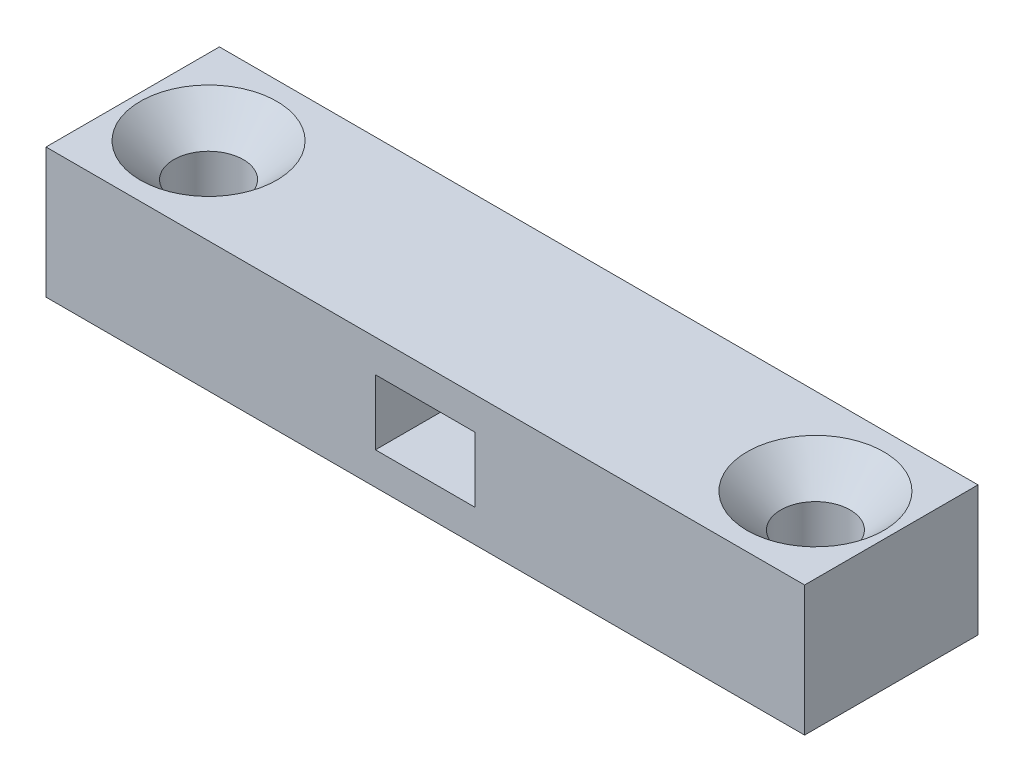
ISO-10303-21;
HEADER;
FILE_DESCRIPTION(('STEP AP214'),'2;1');
FILE_NAME('part.step','',(''),(''),'','','');
FILE_SCHEMA(('AUTOMOTIVE_DESIGN { 1 0 10303 214 1 1 1 1 }'));
ENDSEC;
DATA;
#1=APPLICATION_CONTEXT('core data for automotive mechanical design processes');
#2=APPLICATION_PROTOCOL_DEFINITION('international standard','automotive_design',2000,#1);
#3=PRODUCT_CONTEXT('',#1,'mechanical');
#4=PRODUCT('Part','Part','',(#3));
#5=PRODUCT_RELATED_PRODUCT_CATEGORY('part','',(#4));
#6=PRODUCT_DEFINITION_FORMATION('','',#4);
#7=PRODUCT_DEFINITION_CONTEXT('part definition',#1,'design');
#8=PRODUCT_DEFINITION('design','',#6,#7);
#9=PRODUCT_DEFINITION_SHAPE('','',#8);
#10=(LENGTH_UNIT() NAMED_UNIT(*) SI_UNIT(.MILLI.,.METRE.));
#11=(NAMED_UNIT(*) PLANE_ANGLE_UNIT() SI_UNIT($,.RADIAN.));
#12=(NAMED_UNIT(*) SI_UNIT($,.STERADIAN.) SOLID_ANGLE_UNIT());
#13=UNCERTAINTY_MEASURE_WITH_UNIT(LENGTH_MEASURE(1.E-05),#10,'distance_accuracy_value','');
#14=(GEOMETRIC_REPRESENTATION_CONTEXT(3) GLOBAL_UNCERTAINTY_ASSIGNED_CONTEXT((#13)) GLOBAL_UNIT_ASSIGNED_CONTEXT((#10,
#11,#12)) REPRESENTATION_CONTEXT('',''));
#15=CARTESIAN_POINT('',(0.,0.,0.));
#16=DIRECTION('',(0.,0.,1.));
#17=DIRECTION('',(1.,0.,0.));
#18=AXIS2_PLACEMENT_3D('',#15,#16,#17);
#19=CARTESIAN_POINT('',(-17.5,-6.,-4.));
#20=DIRECTION('',(-1.,0.,0.));
#21=DIRECTION('',(0.,0.,1.));
#22=AXIS2_PLACEMENT_3D('',#19,#20,#21);
#23=PLANE('',#22);
#24=DIRECTION('',(0.,0.,1.));
#25=VECTOR('',#24,1.);
#26=CARTESIAN_POINT('',(-17.5,0.,-4.));
#27=LINE('',#26,#25);
#28=CARTESIAN_POINT('',(-17.5,0.,-4.));
#29=VERTEX_POINT('',#28);
#30=CARTESIAN_POINT('',(-17.5,0.,4.));
#31=VERTEX_POINT('',#30);
#32=EDGE_CURVE('E143',#29,#31,#27,.T.);
#33=ORIENTED_EDGE('',*,*,#32,.F.);
#34=DIRECTION('',(0.,1.,0.));
#35=VECTOR('',#34,1.);
#36=CARTESIAN_POINT('',(-17.5,-6.,-4.));
#37=LINE('',#36,#35);
#38=CARTESIAN_POINT('',(-17.5,-6.,-4.));
#39=VERTEX_POINT('',#38);
#40=EDGE_CURVE('E11',#39,#29,#37,.T.);
#41=ORIENTED_EDGE('',*,*,#40,.F.);
#42=DIRECTION('',(0.,0.,1.));
#43=VECTOR('',#42,1.);
#44=CARTESIAN_POINT('',(-17.5,-6.,-4.));
#45=LINE('',#44,#43);
#46=CARTESIAN_POINT('',(-17.5,-6.,4.));
#47=VERTEX_POINT('',#46);
#48=EDGE_CURVE('E147',#39,#47,#45,.T.);
#49=ORIENTED_EDGE('',*,*,#48,.T.);
#50=DIRECTION('',(0.,1.,0.));
#51=VECTOR('',#50,1.);
#52=CARTESIAN_POINT('',(-17.5,-6.,4.));
#53=LINE('',#52,#51);
#54=EDGE_CURVE('E38',#47,#31,#53,.T.);
#55=ORIENTED_EDGE('',*,*,#54,.T.);
#56=EDGE_LOOP('',(#33,#41,#49,#55));
#57=FACE_BOUND('',#56,.T.);
#58=ADVANCED_FACE('F35',(#57),#23,.T.);
#59=CARTESIAN_POINT('',(-17.5,-6.,-4.));
#60=DIRECTION('',(0.,0.,1.));
#61=DIRECTION('',(1.,0.,0.));
#62=AXIS2_PLACEMENT_3D('',#59,#60,#61);
#63=PLANE('',#62);
#64=DIRECTION('',(1.,0.,0.));
#65=VECTOR('',#64,1.);
#66=CARTESIAN_POINT('',(-17.5,0.,-4.));
#67=LINE('',#66,#65);
#68=CARTESIAN_POINT('',(17.5,0.,-4.));
#69=VERTEX_POINT('',#68);
#70=EDGE_CURVE('E150',#29,#69,#67,.T.);
#71=ORIENTED_EDGE('',*,*,#70,.T.);
#72=DIRECTION('',(0.,1.,0.));
#73=VECTOR('',#72,1.);
#74=CARTESIAN_POINT('',(17.5,-6.,-4.));
#75=LINE('',#74,#73);
#76=CARTESIAN_POINT('',(17.5,-6.,-4.));
#77=VERTEX_POINT('',#76);
#78=EDGE_CURVE('E43',#77,#69,#75,.T.);
#79=ORIENTED_EDGE('',*,*,#78,.F.);
#80=DIRECTION('',(1.,0.,0.));
#81=VECTOR('',#80,1.);
#82=CARTESIAN_POINT('',(-17.5,-6.,-4.));
#83=LINE('',#82,#81);
#84=EDGE_CURVE('E154',#39,#77,#83,.T.);
#85=ORIENTED_EDGE('',*,*,#84,.F.);
#86=ORIENTED_EDGE('',*,*,#40,.T.);
#87=EDGE_LOOP('',(#71,#79,#85,#86));
#88=FACE_BOUND('',#87,.T.);
#89=ADVANCED_FACE('F174',(#88),#63,.F.);
#90=CARTESIAN_POINT('',(17.5,-6.,-4.));
#91=DIRECTION('',(-1.,0.,0.));
#92=DIRECTION('',(0.,0.,1.));
#93=AXIS2_PLACEMENT_3D('',#90,#91,#92);
#94=PLANE('',#93);
#95=DIRECTION('',(0.,0.,1.));
#96=VECTOR('',#95,1.);
#97=CARTESIAN_POINT('',(17.5,0.,-4.));
#98=LINE('',#97,#96);
#99=CARTESIAN_POINT('',(17.5,0.,4.));
#100=VERTEX_POINT('',#99);
#101=EDGE_CURVE('E161',#69,#100,#98,.T.);
#102=ORIENTED_EDGE('',*,*,#101,.T.);
#103=DIRECTION('',(0.,1.,0.));
#104=VECTOR('',#103,1.);
#105=CARTESIAN_POINT('',(17.5,-6.,4.));
#106=LINE('',#105,#104);
#107=CARTESIAN_POINT('',(17.5,-6.,4.));
#108=VERTEX_POINT('',#107);
#109=EDGE_CURVE('E166',#108,#100,#106,.T.);
#110=ORIENTED_EDGE('',*,*,#109,.F.);
#111=DIRECTION('',(0.,0.,1.));
#112=VECTOR('',#111,1.);
#113=CARTESIAN_POINT('',(17.5,-6.,-4.));
#114=LINE('',#113,#112);
#115=EDGE_CURVE('E152',#77,#108,#114,.T.);
#116=ORIENTED_EDGE('',*,*,#115,.F.);
#117=ORIENTED_EDGE('',*,*,#78,.T.);
#118=EDGE_LOOP('',(#102,#110,#116,#117));
#119=FACE_BOUND('',#118,.T.);
#120=ADVANCED_FACE('F177',(#119),#94,.F.);
#121=CARTESIAN_POINT('',(-17.5,-6.,4.));
#122=DIRECTION('',(0.,0.,1.));
#123=DIRECTION('',(1.,0.,0.));
#124=AXIS2_PLACEMENT_3D('',#121,#122,#123);
#125=PLANE('',#124);
#126=DIRECTION('',(0.,-1.,0.));
#127=VECTOR('',#126,1.);
#128=CARTESIAN_POINT('',(-2.3,-1.5,4.));
#129=LINE('',#128,#127);
#130=CARTESIAN_POINT('',(-2.3,-1.5,4.));
#131=VERTEX_POINT('',#130);
#132=CARTESIAN_POINT('',(-2.3,-4.5,4.));
#133=VERTEX_POINT('',#132);
#134=EDGE_CURVE('E51',#131,#133,#129,.T.);
#135=ORIENTED_EDGE('',*,*,#134,.F.);
#136=DIRECTION('',(1.,0.,0.));
#137=VECTOR('',#136,1.);
#138=CARTESIAN_POINT('',(-2.3,-1.5,4.));
#139=LINE('',#138,#137);
#140=CARTESIAN_POINT('',(2.3,-1.5,4.));
#141=VERTEX_POINT('',#140);
#142=EDGE_CURVE('E125',#131,#141,#139,.T.);
#143=ORIENTED_EDGE('',*,*,#142,.T.);
#144=DIRECTION('',(0.,-1.,0.));
#145=VECTOR('',#144,1.);
#146=CARTESIAN_POINT('',(2.3,-1.5,4.));
#147=LINE('',#146,#145);
#148=CARTESIAN_POINT('',(2.3,-4.5,4.));
#149=VERTEX_POINT('',#148);
#150=EDGE_CURVE('E128',#141,#149,#147,.T.);
#151=ORIENTED_EDGE('',*,*,#150,.T.);
#152=DIRECTION('',(1.,0.,0.));
#153=VECTOR('',#152,1.);
#154=CARTESIAN_POINT('',(-2.3,-4.5,4.));
#155=LINE('',#154,#153);
#156=EDGE_CURVE('E137',#133,#149,#155,.T.);
#157=ORIENTED_EDGE('',*,*,#156,.F.);
#158=EDGE_LOOP('',(#135,#143,#151,#157));
#159=FACE_BOUND('',#158,.T.);
#160=DIRECTION('',(1.,0.,0.));
#161=VECTOR('',#160,1.);
#162=CARTESIAN_POINT('',(-17.5,0.,4.));
#163=LINE('',#162,#161);
#164=EDGE_CURVE('E158',#31,#100,#163,.T.);
#165=ORIENTED_EDGE('',*,*,#164,.F.);
#166=ORIENTED_EDGE('',*,*,#54,.F.);
#167=DIRECTION('',(1.,0.,0.));
#168=VECTOR('',#167,1.);
#169=CARTESIAN_POINT('',(-17.5,-6.,4.));
#170=LINE('',#169,#168);
#171=EDGE_CURVE('E149',#47,#108,#170,.T.);
#172=ORIENTED_EDGE('',*,*,#171,.T.);
#173=ORIENTED_EDGE('',*,*,#109,.T.);
#174=EDGE_LOOP('',(#165,#166,#172,#173));
#175=FACE_BOUND('',#174,.T.);
#176=ADVANCED_FACE('F169',(#159,#175),#125,.T.);
#177=CARTESIAN_POINT('',(0.,-6.,0.));
#178=DIRECTION('',(0.,1.,0.));
#179=DIRECTION('',(0.,0.,1.));
#180=AXIS2_PLACEMENT_3D('',#177,#178,#179);
#181=PLANE('',#180);
#182=CARTESIAN_POINT('',(-14.,-6.00000000000001,0.));
#183=DIRECTION('',(0.,1.,0.));
#184=DIRECTION('',(0.,0.,1.));
#185=AXIS2_PLACEMENT_3D('',#182,#183,#184);
#186=CIRCLE('',#185,1.59999999999999);
#187=CARTESIAN_POINT('',(-14.,-6.00000000000001,1.59999999999999));
#188=VERTEX_POINT('',#187);
#189=EDGE_CURVE('E313',#188,#188,#186,.T.);
#190=ORIENTED_EDGE('',*,*,#189,.T.);
#191=EDGE_LOOP('',(#190));
#192=FACE_BOUND('',#191,.T.);
#193=CARTESIAN_POINT('',(14.,-6.00000000000001,0.));
#194=DIRECTION('',(0.,1.,0.));
#195=DIRECTION('',(0.,0.,1.));
#196=AXIS2_PLACEMENT_3D('',#193,#194,#195);
#197=CIRCLE('',#196,1.59999999999999);
#198=CARTESIAN_POINT('',(14.,-6.00000000000001,1.59999999999998));
#199=VERTEX_POINT('',#198);
#200=EDGE_CURVE('E131',#199,#199,#197,.T.);
#201=ORIENTED_EDGE('',*,*,#200,.T.);
#202=EDGE_LOOP('',(#201));
#203=FACE_BOUND('',#202,.T.);
#204=ORIENTED_EDGE('',*,*,#48,.F.);
#205=ORIENTED_EDGE('',*,*,#84,.T.);
#206=ORIENTED_EDGE('',*,*,#115,.T.);
#207=ORIENTED_EDGE('',*,*,#171,.F.);
#208=EDGE_LOOP('',(#204,#205,#206,#207));
#209=FACE_BOUND('',#208,.T.);
#210=ADVANCED_FACE('F179',(#192,#203,#209),#181,.F.);
#211=CARTESIAN_POINT('',(0.,0.,0.));
#212=DIRECTION('',(0.,1.,0.));
#213=DIRECTION('',(0.,0.,1.));
#214=AXIS2_PLACEMENT_3D('',#211,#212,#213);
#215=PLANE('',#214);
#216=CARTESIAN_POINT('',(-14.,0.,0.));
#217=DIRECTION('',(0.,1.,0.));
#218=DIRECTION('',(0.,0.,1.));
#219=AXIS2_PLACEMENT_3D('',#216,#217,#218);
#220=CIRCLE('',#219,3.15);
#221=CARTESIAN_POINT('',(-14.,0.,3.15));
#222=VERTEX_POINT('',#221);
#223=EDGE_CURVE('E311',#222,#222,#220,.T.);
#224=ORIENTED_EDGE('',*,*,#223,.F.);
#225=EDGE_LOOP('',(#224));
#226=FACE_BOUND('',#225,.T.);
#227=CARTESIAN_POINT('',(14.,0.,0.));
#228=DIRECTION('',(0.,1.,0.));
#229=DIRECTION('',(0.,0.,1.));
#230=AXIS2_PLACEMENT_3D('',#227,#228,#229);
#231=CIRCLE('',#230,3.15);
#232=CARTESIAN_POINT('',(14.,0.,3.14999999999999));
#233=VERTEX_POINT('',#232);
#234=EDGE_CURVE('E317',#233,#233,#231,.T.);
#235=ORIENTED_EDGE('',*,*,#234,.F.);
#236=EDGE_LOOP('',(#235));
#237=FACE_BOUND('',#236,.T.);
#238=ORIENTED_EDGE('',*,*,#32,.T.);
#239=ORIENTED_EDGE('',*,*,#164,.T.);
#240=ORIENTED_EDGE('',*,*,#101,.F.);
#241=ORIENTED_EDGE('',*,*,#70,.F.);
#242=EDGE_LOOP('',(#238,#239,#240,#241));
#243=FACE_BOUND('',#242,.T.);
#244=ADVANCED_FACE('F172',(#226,#237,#243),#215,.T.);
#245=CARTESIAN_POINT('',(-2.3,-1.5,-1.));
#246=DIRECTION('',(-1.,0.,0.));
#247=DIRECTION('',(0.,-1.,0.));
#248=AXIS2_PLACEMENT_3D('',#245,#246,#247);
#249=PLANE('',#248);
#250=ORIENTED_EDGE('',*,*,#134,.T.);
#251=DIRECTION('',(0.,0.,1.));
#252=VECTOR('',#251,1.);
#253=CARTESIAN_POINT('',(-2.3,-4.5,-1.));
#254=LINE('',#253,#252);
#255=CARTESIAN_POINT('',(-2.3,-4.5,-1.));
#256=VERTEX_POINT('',#255);
#257=EDGE_CURVE('E104',#256,#133,#254,.T.);
#258=ORIENTED_EDGE('',*,*,#257,.F.);
#259=DIRECTION('',(0.,-1.,0.));
#260=VECTOR('',#259,1.);
#261=CARTESIAN_POINT('',(-2.3,-1.5,-1.));
#262=LINE('',#261,#260);
#263=CARTESIAN_POINT('',(-2.3,-1.5,-1.));
#264=VERTEX_POINT('',#263);
#265=EDGE_CURVE('E108',#264,#256,#262,.T.);
#266=ORIENTED_EDGE('',*,*,#265,.F.);
#267=DIRECTION('',(0.,0.,1.));
#268=VECTOR('',#267,1.);
#269=CARTESIAN_POINT('',(-2.3,-1.5,-1.));
#270=LINE('',#269,#268);
#271=EDGE_CURVE('E141',#264,#131,#270,.T.);
#272=ORIENTED_EDGE('',*,*,#271,.T.);
#273=EDGE_LOOP('',(#250,#258,#266,#272));
#274=FACE_BOUND('',#273,.T.);
#275=ADVANCED_FACE('F106',(#274),#249,.F.);
#276=CARTESIAN_POINT('',(-2.3,-1.5,-1.));
#277=DIRECTION('',(0.,-1.,0.));
#278=DIRECTION('',(1.,0.,0.));
#279=AXIS2_PLACEMENT_3D('',#276,#277,#278);
#280=PLANE('',#279);
#281=ORIENTED_EDGE('',*,*,#142,.F.);
#282=ORIENTED_EDGE('',*,*,#271,.F.);
#283=DIRECTION('',(1.,0.,0.));
#284=VECTOR('',#283,1.);
#285=CARTESIAN_POINT('',(-2.3,-1.5,-1.));
#286=LINE('',#285,#284);
#287=CARTESIAN_POINT('',(2.3,-1.5,-1.));
#288=VERTEX_POINT('',#287);
#289=EDGE_CURVE('E113',#264,#288,#286,.T.);
#290=ORIENTED_EDGE('',*,*,#289,.T.);
#291=DIRECTION('',(0.,0.,1.));
#292=VECTOR('',#291,1.);
#293=CARTESIAN_POINT('',(2.3,-1.5,-1.));
#294=LINE('',#293,#292);
#295=EDGE_CURVE('E144',#288,#141,#294,.T.);
#296=ORIENTED_EDGE('',*,*,#295,.T.);
#297=EDGE_LOOP('',(#281,#282,#290,#296));
#298=FACE_BOUND('',#297,.T.);
#299=ADVANCED_FACE('F218',(#298),#280,.T.);
#300=CARTESIAN_POINT('',(2.3,-1.5,-1.));
#301=DIRECTION('',(-1.,0.,0.));
#302=DIRECTION('',(0.,0.,1.));
#303=AXIS2_PLACEMENT_3D('',#300,#301,#302);
#304=PLANE('',#303);
#305=ORIENTED_EDGE('',*,*,#150,.F.);
#306=ORIENTED_EDGE('',*,*,#295,.F.);
#307=DIRECTION('',(0.,-1.,0.));
#308=VECTOR('',#307,1.);
#309=CARTESIAN_POINT('',(2.3,-1.5,-1.));
#310=LINE('',#309,#308);
#311=CARTESIAN_POINT('',(2.3,-4.5,-1.));
#312=VERTEX_POINT('',#311);
#313=EDGE_CURVE('E121',#288,#312,#310,.T.);
#314=ORIENTED_EDGE('',*,*,#313,.T.);
#315=DIRECTION('',(0.,0.,1.));
#316=VECTOR('',#315,1.);
#317=CARTESIAN_POINT('',(2.3,-4.5,-1.));
#318=LINE('',#317,#316);
#319=EDGE_CURVE('E112',#312,#149,#318,.T.);
#320=ORIENTED_EDGE('',*,*,#319,.T.);
#321=EDGE_LOOP('',(#305,#306,#314,#320));
#322=FACE_BOUND('',#321,.T.);
#323=ADVANCED_FACE('F227',(#322),#304,.T.);
#324=CARTESIAN_POINT('',(-2.3,-4.5,-1.));
#325=DIRECTION('',(0.,-1.,0.));
#326=DIRECTION('',(0.,0.,-1.));
#327=AXIS2_PLACEMENT_3D('',#324,#325,#326);
#328=PLANE('',#327);
#329=ORIENTED_EDGE('',*,*,#156,.T.);
#330=ORIENTED_EDGE('',*,*,#319,.F.);
#331=DIRECTION('',(1.,0.,0.));
#332=VECTOR('',#331,1.);
#333=CARTESIAN_POINT('',(-2.3,-4.5,-1.));
#334=LINE('',#333,#332);
#335=EDGE_CURVE('E117',#256,#312,#334,.T.);
#336=ORIENTED_EDGE('',*,*,#335,.F.);
#337=ORIENTED_EDGE('',*,*,#257,.T.);
#338=EDGE_LOOP('',(#329,#330,#336,#337));
#339=FACE_BOUND('',#338,.T.);
#340=ADVANCED_FACE('F118',(#339),#328,.F.);
#341=CARTESIAN_POINT('',(0.,0.,-1.));
#342=DIRECTION('',(0.,0.,1.));
#343=DIRECTION('',(1.,0.,0.));
#344=AXIS2_PLACEMENT_3D('',#341,#342,#343);
#345=PLANE('',#344);
#346=ORIENTED_EDGE('',*,*,#265,.T.);
#347=ORIENTED_EDGE('',*,*,#335,.T.);
#348=ORIENTED_EDGE('',*,*,#313,.F.);
#349=ORIENTED_EDGE('',*,*,#289,.F.);
#350=EDGE_LOOP('',(#346,#347,#348,#349));
#351=FACE_BOUND('',#350,.T.);
#352=ADVANCED_FACE('F124',(#351),#345,.T.);
#353=CARTESIAN_POINT('',(14.,0.,0.));
#354=DIRECTION('',(0.,1.,0.));
#355=DIRECTION('',(0.,0.,1.));
#356=AXIS2_PLACEMENT_3D('',#353,#354,#355);
#357=CYLINDRICAL_SURFACE('',#356,1.59999999999999);
#358=ORIENTED_EDGE('',*,*,#200,.F.);
#359=EDGE_LOOP('',(#358));
#360=FACE_BOUND('',#359,.T.);
#361=CARTESIAN_POINT('',(14.,-1.55,0.));
#362=DIRECTION('',(0.,1.,0.));
#363=DIRECTION('',(0.,0.,1.));
#364=AXIS2_PLACEMENT_3D('',#361,#362,#363);
#365=CIRCLE('',#364,1.6);
#366=CARTESIAN_POINT('',(14.,-1.55,1.59999999999999));
#367=VERTEX_POINT('',#366);
#368=EDGE_CURVE('E319',#367,#367,#365,.T.);
#369=ORIENTED_EDGE('',*,*,#368,.T.);
#370=EDGE_LOOP('',(#369));
#371=FACE_BOUND('',#370,.T.);
#372=ADVANCED_FACE('F253',(#360,#371),#357,.F.);
#373=CARTESIAN_POINT('',(14.,0.,0.));
#374=DIRECTION('',(0.,1.,0.));
#375=DIRECTION('',(0.,0.,1.));
#376=AXIS2_PLACEMENT_3D('',#373,#374,#375);
#377=CONICAL_SURFACE('',#376,3.15,0.785398163397448);
#378=ORIENTED_EDGE('',*,*,#368,.F.);
#379=EDGE_LOOP('',(#378));
#380=FACE_BOUND('',#379,.T.);
#381=ORIENTED_EDGE('',*,*,#234,.T.);
#382=EDGE_LOOP('',(#381));
#383=FACE_BOUND('',#382,.T.);
#384=ADVANCED_FACE('F271',(#380,#383),#377,.F.);
#385=CARTESIAN_POINT('',(-14.,0.,0.));
#386=DIRECTION('',(0.,1.,0.));
#387=DIRECTION('',(0.,0.,1.));
#388=AXIS2_PLACEMENT_3D('',#385,#386,#387);
#389=CYLINDRICAL_SURFACE('',#388,1.59999999999999);
#390=ORIENTED_EDGE('',*,*,#189,.F.);
#391=EDGE_LOOP('',(#390));
#392=FACE_BOUND('',#391,.T.);
#393=CARTESIAN_POINT('',(-14.,-1.55,0.));
#394=DIRECTION('',(0.,1.,0.));
#395=DIRECTION('',(0.,0.,1.));
#396=AXIS2_PLACEMENT_3D('',#393,#394,#395);
#397=CIRCLE('',#396,1.6);
#398=CARTESIAN_POINT('',(-14.,-1.55,1.6));
#399=VERTEX_POINT('',#398);
#400=EDGE_CURVE('E308',#399,#399,#397,.T.);
#401=ORIENTED_EDGE('',*,*,#400,.T.);
#402=EDGE_LOOP('',(#401));
#403=FACE_BOUND('',#402,.T.);
#404=ADVANCED_FACE('F281',(#392,#403),#389,.F.);
#405=CARTESIAN_POINT('',(-14.,0.,0.));
#406=DIRECTION('',(0.,1.,0.));
#407=DIRECTION('',(0.,0.,1.));
#408=AXIS2_PLACEMENT_3D('',#405,#406,#407);
#409=CONICAL_SURFACE('',#408,3.15,0.785398163397448);
#410=ORIENTED_EDGE('',*,*,#400,.F.);
#411=EDGE_LOOP('',(#410));
#412=FACE_BOUND('',#411,.T.);
#413=ORIENTED_EDGE('',*,*,#223,.T.);
#414=EDGE_LOOP('',(#413));
#415=FACE_BOUND('',#414,.T.);
#416=ADVANCED_FACE('F291',(#412,#415),#409,.F.);
#417=CLOSED_SHELL('',(#58,#89,#120,#176,#210,#244,#275,#299,#323,#340,#352,#372,#384,#404,#416));
#418=MANIFOLD_SOLID_BREP('B2',#417);
#419=ADVANCED_BREP_SHAPE_REPRESENTATION('',(#18,#418),#14);
#420=SHAPE_DEFINITION_REPRESENTATION(#9,#419);
ENDSEC;
END-ISO-10303-21;
